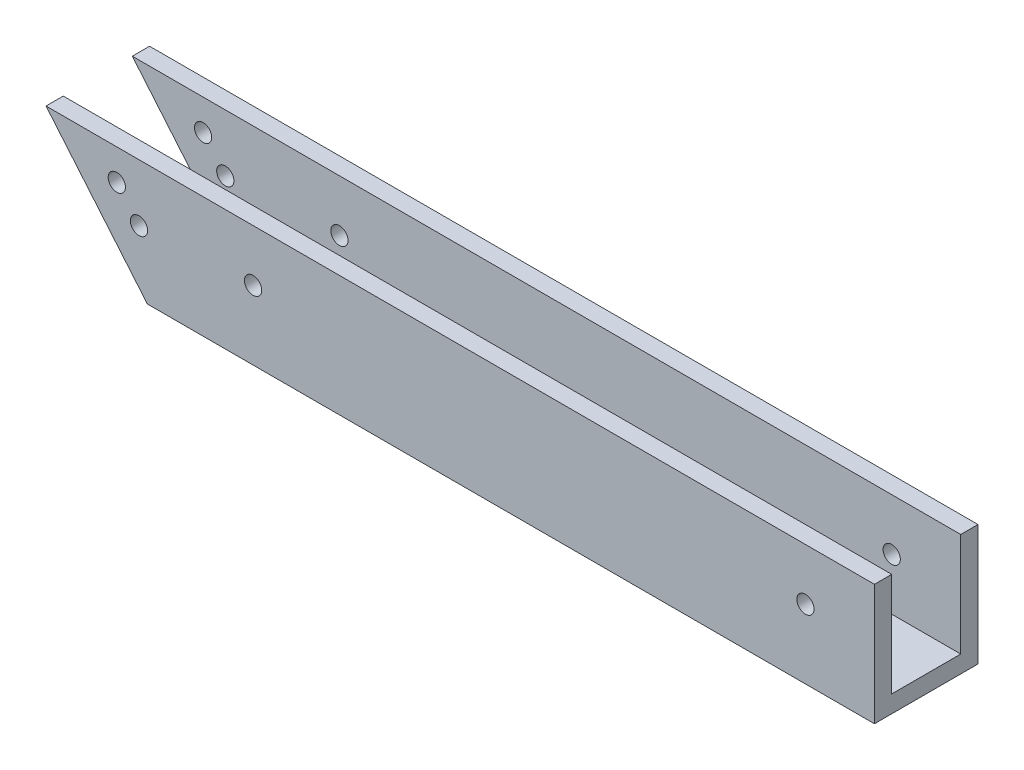
ISO-10303-21;
HEADER;
FILE_DESCRIPTION(('STEP AP214'),'2;1');
FILE_NAME('part.step','',(''),(''),'','','');
FILE_SCHEMA(('AUTOMOTIVE_DESIGN { 1 0 10303 214 1 1 1 1 }'));
ENDSEC;
DATA;
#1=APPLICATION_CONTEXT('core data for automotive mechanical design processes');
#2=APPLICATION_PROTOCOL_DEFINITION('international standard','automotive_design',2000,#1);
#3=PRODUCT_CONTEXT('',#1,'mechanical');
#4=PRODUCT('Part','Part','',(#3));
#5=PRODUCT_RELATED_PRODUCT_CATEGORY('part','',(#4));
#6=PRODUCT_DEFINITION_FORMATION('','',#4);
#7=PRODUCT_DEFINITION_CONTEXT('part definition',#1,'design');
#8=PRODUCT_DEFINITION('design','',#6,#7);
#9=PRODUCT_DEFINITION_SHAPE('','',#8);
#10=(LENGTH_UNIT() NAMED_UNIT(*) SI_UNIT(.MILLI.,.METRE.));
#11=(NAMED_UNIT(*) PLANE_ANGLE_UNIT() SI_UNIT($,.RADIAN.));
#12=(NAMED_UNIT(*) SI_UNIT($,.STERADIAN.) SOLID_ANGLE_UNIT());
#13=UNCERTAINTY_MEASURE_WITH_UNIT(LENGTH_MEASURE(1.E-05),#10,'distance_accuracy_value','');
#14=(GEOMETRIC_REPRESENTATION_CONTEXT(3) GLOBAL_UNCERTAINTY_ASSIGNED_CONTEXT((#13)) GLOBAL_UNIT_ASSIGNED_CONTEXT((#10,
#11,#12)) REPRESENTATION_CONTEXT('',''));
#15=CARTESIAN_POINT('',(0.,0.,0.));
#16=DIRECTION('',(0.,0.,1.));
#17=DIRECTION('',(1.,0.,0.));
#18=AXIS2_PLACEMENT_3D('',#15,#16,#17);
#19=CARTESIAN_POINT('',(0.,44.45,0.));
#20=DIRECTION('',(0.,-1.,0.));
#21=DIRECTION('',(0.,0.,-1.));
#22=AXIS2_PLACEMENT_3D('',#19,#20,#21);
#23=PLANE('',#22);
#24=DIRECTION('',(0.,0.,1.));
#25=VECTOR('',#24,1.);
#26=CARTESIAN_POINT('',(-152.4,44.45,19.05));
#27=LINE('',#26,#25);
#28=CARTESIAN_POINT('',(-152.4,44.45,-19.05));
#29=VERTEX_POINT('',#28);
#30=CARTESIAN_POINT('',(-152.4,44.45,-12.7));
#31=VERTEX_POINT('',#30);
#32=EDGE_CURVE('E129',#29,#31,#27,.T.);
#33=ORIENTED_EDGE('',*,*,#32,.T.);
#34=DIRECTION('',(-1.,0.,0.));
#35=VECTOR('',#34,1.);
#36=CARTESIAN_POINT('',(152.4,44.45,-12.7));
#37=LINE('',#36,#35);
#38=CARTESIAN_POINT('',(152.4,44.45,-12.7));
#39=VERTEX_POINT('',#38);
#40=EDGE_CURVE('E161',#39,#31,#37,.T.);
#41=ORIENTED_EDGE('',*,*,#40,.F.);
#42=DIRECTION('',(0.,0.,-1.));
#43=VECTOR('',#42,1.);
#44=CARTESIAN_POINT('',(152.4,44.45,19.05));
#45=LINE('',#44,#43);
#46=CARTESIAN_POINT('',(152.4,44.45,-19.05));
#47=VERTEX_POINT('',#46);
#48=EDGE_CURVE('E89',#39,#47,#45,.T.);
#49=ORIENTED_EDGE('',*,*,#48,.T.);
#50=DIRECTION('',(-1.,0.,0.));
#51=VECTOR('',#50,1.);
#52=CARTESIAN_POINT('',(-152.4,44.45,-19.05));
#53=LINE('',#52,#51);
#54=EDGE_CURVE('E117',#47,#29,#53,.T.);
#55=ORIENTED_EDGE('',*,*,#54,.T.);
#56=EDGE_LOOP('',(#33,#41,#49,#55));
#57=FACE_BOUND('',#56,.T.);
#58=ADVANCED_FACE('F41',(#57),#23,.F.);
#59=CARTESIAN_POINT('',(152.4,44.45,19.05));
#60=DIRECTION('',(-1.,0.,0.));
#61=DIRECTION('',(0.,0.,1.));
#62=AXIS2_PLACEMENT_3D('',#59,#60,#61);
#63=PLANE('',#62);
#64=ORIENTED_EDGE('',*,*,#48,.F.);
#65=DIRECTION('',(0.,1.,0.));
#66=VECTOR('',#65,1.);
#67=CARTESIAN_POINT('',(152.4,6.34999999999999,-12.7));
#68=LINE('',#67,#66);
#69=CARTESIAN_POINT('',(152.4,6.34999999999999,-12.7));
#70=VERTEX_POINT('',#69);
#71=EDGE_CURVE('E103',#70,#39,#68,.T.);
#72=ORIENTED_EDGE('',*,*,#71,.F.);
#73=DIRECTION('',(0.,0.,-1.));
#74=VECTOR('',#73,1.);
#75=CARTESIAN_POINT('',(152.4,6.34999999999999,12.7));
#76=LINE('',#75,#74);
#77=CARTESIAN_POINT('',(152.4,6.34999999999999,12.7));
#78=VERTEX_POINT('',#77);
#79=EDGE_CURVE('E160',#78,#70,#76,.T.);
#80=ORIENTED_EDGE('',*,*,#79,.F.);
#81=DIRECTION('',(0.,1.,0.));
#82=VECTOR('',#81,1.);
#83=CARTESIAN_POINT('',(152.4,6.34999999999999,12.7));
#84=LINE('',#83,#82);
#85=CARTESIAN_POINT('',(152.4,44.45,12.7));
#86=VERTEX_POINT('',#85);
#87=EDGE_CURVE('E107',#78,#86,#84,.T.);
#88=ORIENTED_EDGE('',*,*,#87,.T.);
#89=CARTESIAN_POINT('',(152.4,44.45,19.05));
#90=VERTEX_POINT('',#89);
#91=EDGE_CURVE('E98',#90,#86,#45,.T.);
#92=ORIENTED_EDGE('',*,*,#91,.F.);
#93=DIRECTION('',(0.,-1.,0.));
#94=VECTOR('',#93,1.);
#95=CARTESIAN_POINT('',(152.4,44.45,19.05));
#96=LINE('',#95,#94);
#97=CARTESIAN_POINT('',(152.4,0.,19.05));
#98=VERTEX_POINT('',#97);
#99=EDGE_CURVE('E81',#90,#98,#96,.T.);
#100=ORIENTED_EDGE('',*,*,#99,.T.);
#101=DIRECTION('',(0.,0.,-1.));
#102=VECTOR('',#101,1.);
#103=CARTESIAN_POINT('',(152.4,0.,19.05));
#104=LINE('',#103,#102);
#105=CARTESIAN_POINT('',(152.4,0.,-19.05));
#106=VERTEX_POINT('',#105);
#107=EDGE_CURVE('E96',#98,#106,#104,.T.);
#108=ORIENTED_EDGE('',*,*,#107,.T.);
#109=DIRECTION('',(0.,-1.,0.));
#110=VECTOR('',#109,1.);
#111=CARTESIAN_POINT('',(152.4,44.45,-19.05));
#112=LINE('',#111,#110);
#113=EDGE_CURVE('E49',#47,#106,#112,.T.);
#114=ORIENTED_EDGE('',*,*,#113,.F.);
#115=EDGE_LOOP('',(#64,#72,#80,#88,#92,#100,#108,#114));
#116=FACE_BOUND('',#115,.T.);
#117=ADVANCED_FACE('F43',(#116),#63,.F.);
#118=CARTESIAN_POINT('',(-152.4,44.45,-19.05));
#119=DIRECTION('',(0.,0.,1.));
#120=DIRECTION('',(1.,0.,0.));
#121=AXIS2_PLACEMENT_3D('',#118,#119,#120);
#122=PLANE('',#121);
#123=CARTESIAN_POINT('',(127.,25.4,-19.05));
#124=DIRECTION('',(0.,0.,1.));
#125=DIRECTION('',(1.,0.,0.));
#126=AXIS2_PLACEMENT_3D('',#123,#124,#125);
#127=CIRCLE('',#126,3.175);
#128=CARTESIAN_POINT('',(130.175,25.4,-19.05));
#129=VERTEX_POINT('',#128);
#130=EDGE_CURVE('E314',#129,#129,#127,.T.);
#131=ORIENTED_EDGE('',*,*,#130,.T.);
#132=EDGE_LOOP('',(#131));
#133=FACE_BOUND('',#132,.T.);
#134=CARTESIAN_POINT('',(-76.2,25.4,-19.05));
#135=DIRECTION('',(0.,0.,1.));
#136=DIRECTION('',(1.,0.,0.));
#137=AXIS2_PLACEMENT_3D('',#134,#135,#136);
#138=CIRCLE('',#137,3.175);
#139=CARTESIAN_POINT('',(-73.025,25.4,-19.05));
#140=VERTEX_POINT('',#139);
#141=EDGE_CURVE('E310',#140,#140,#138,.T.);
#142=ORIENTED_EDGE('',*,*,#141,.T.);
#143=EDGE_LOOP('',(#142));
#144=FACE_BOUND('',#143,.T.);
#145=CARTESIAN_POINT('',(-118.181027643332,23.4271093601861,-19.05));
#146=DIRECTION('',(0.,0.,1.));
#147=DIRECTION('',(1.,0.,0.));
#148=AXIS2_PLACEMENT_3D('',#145,#146,#147);
#149=CIRCLE('',#148,3.175);
#150=CARTESIAN_POINT('',(-115.006027643332,23.4271093601861,-19.05));
#151=VERTEX_POINT('',#150);
#152=EDGE_CURVE('E271',#151,#151,#149,.T.);
#153=ORIENTED_EDGE('',*,*,#152,.T.);
#154=EDGE_LOOP('',(#153));
#155=FACE_BOUND('',#154,.T.);
#156=CARTESIAN_POINT('',(-126.344430286351,33.1558737877971,-19.05));
#157=DIRECTION('',(0.,0.,1.));
#158=DIRECTION('',(1.,0.,0.));
#159=AXIS2_PLACEMENT_3D('',#156,#157,#158);
#160=CIRCLE('',#159,3.175);
#161=CARTESIAN_POINT('',(-123.169430286351,33.1558737877971,-19.05));
#162=VERTEX_POINT('',#161);
#163=EDGE_CURVE('E266',#162,#162,#160,.T.);
#164=ORIENTED_EDGE('',*,*,#163,.T.);
#165=EDGE_LOOP('',(#164));
#166=FACE_BOUND('',#165,.T.);
#167=DIRECTION('',(-1.,0.,0.));
#168=VECTOR('',#167,1.);
#169=CARTESIAN_POINT('',(-152.4,0.,-19.05));
#170=LINE('',#169,#168);
#171=CARTESIAN_POINT('',(-115.10202139417,0.,-19.05));
#172=VERTEX_POINT('',#171);
#173=EDGE_CURVE('E90',#106,#172,#170,.T.);
#174=ORIENTED_EDGE('',*,*,#173,.T.);
#175=DIRECTION('',(-0.642787609686541,0.766044443118977,0.));
#176=VECTOR('',#175,1.);
#177=CARTESIAN_POINT('',(-152.4,44.45,-19.05));
#178=LINE('',#177,#176);
#179=EDGE_CURVE('E155',#172,#29,#178,.T.);
#180=ORIENTED_EDGE('',*,*,#179,.T.);
#181=ORIENTED_EDGE('',*,*,#54,.F.);
#182=ORIENTED_EDGE('',*,*,#113,.T.);
#183=EDGE_LOOP('',(#174,#180,#181,#182));
#184=FACE_BOUND('',#183,.T.);
#185=ADVANCED_FACE('F113',(#133,#144,#155,#166,#184),#122,.F.);
#186=CARTESIAN_POINT('',(-152.4,44.45,19.05));
#187=DIRECTION('',(0.,0.,-1.));
#188=DIRECTION('',(-1.,0.,0.));
#189=AXIS2_PLACEMENT_3D('',#186,#187,#188);
#190=PLANE('',#189);
#191=CARTESIAN_POINT('',(127.,25.4,19.05));
#192=DIRECTION('',(0.,0.,1.));
#193=DIRECTION('',(1.,0.,0.));
#194=AXIS2_PLACEMENT_3D('',#191,#192,#193);
#195=CIRCLE('',#194,3.175);
#196=CARTESIAN_POINT('',(130.175,25.4,19.05));
#197=VERTEX_POINT('',#196);
#198=EDGE_CURVE('E200',#197,#197,#195,.T.);
#199=ORIENTED_EDGE('',*,*,#198,.F.);
#200=EDGE_LOOP('',(#199));
#201=FACE_BOUND('',#200,.T.);
#202=CARTESIAN_POINT('',(-76.2,25.4,19.05));
#203=DIRECTION('',(0.,0.,1.));
#204=DIRECTION('',(1.,0.,0.));
#205=AXIS2_PLACEMENT_3D('',#202,#203,#204);
#206=CIRCLE('',#205,3.175);
#207=CARTESIAN_POINT('',(-73.025,25.4,19.05));
#208=VERTEX_POINT('',#207);
#209=EDGE_CURVE('E204',#208,#208,#206,.T.);
#210=ORIENTED_EDGE('',*,*,#209,.F.);
#211=EDGE_LOOP('',(#210));
#212=FACE_BOUND('',#211,.T.);
#213=CARTESIAN_POINT('',(-118.181027643332,23.4271093601861,19.05));
#214=DIRECTION('',(0.,0.,1.));
#215=DIRECTION('',(1.,0.,0.));
#216=AXIS2_PLACEMENT_3D('',#213,#214,#215);
#217=CIRCLE('',#216,3.175);
#218=CARTESIAN_POINT('',(-115.006027643332,23.4271093601861,19.05));
#219=VERTEX_POINT('',#218);
#220=EDGE_CURVE('E208',#219,#219,#217,.T.);
#221=ORIENTED_EDGE('',*,*,#220,.F.);
#222=EDGE_LOOP('',(#221));
#223=FACE_BOUND('',#222,.T.);
#224=CARTESIAN_POINT('',(-126.344430286351,33.1558737877971,19.05));
#225=DIRECTION('',(0.,0.,1.));
#226=DIRECTION('',(1.,0.,0.));
#227=AXIS2_PLACEMENT_3D('',#224,#225,#226);
#228=CIRCLE('',#227,3.175);
#229=CARTESIAN_POINT('',(-123.169430286351,33.1558737877971,19.05));
#230=VERTEX_POINT('',#229);
#231=EDGE_CURVE('E211',#230,#230,#228,.T.);
#232=ORIENTED_EDGE('',*,*,#231,.F.);
#233=EDGE_LOOP('',(#232));
#234=FACE_BOUND('',#233,.T.);
#235=DIRECTION('',(1.,0.,0.));
#236=VECTOR('',#235,1.);
#237=CARTESIAN_POINT('',(-152.4,44.45,19.05));
#238=LINE('',#237,#236);
#239=CARTESIAN_POINT('',(-152.4,44.45,19.05));
#240=VERTEX_POINT('',#239);
#241=EDGE_CURVE('E64',#240,#90,#238,.T.);
#242=ORIENTED_EDGE('',*,*,#241,.F.);
#243=DIRECTION('',(-0.642787609686541,0.766044443118977,0.));
#244=VECTOR('',#243,1.);
#245=CARTESIAN_POINT('',(-152.4,44.45,19.05));
#246=LINE('',#245,#244);
#247=CARTESIAN_POINT('',(-115.10202139417,0.,19.05));
#248=VERTEX_POINT('',#247);
#249=EDGE_CURVE('E85',#248,#240,#246,.T.);
#250=ORIENTED_EDGE('',*,*,#249,.F.);
#251=DIRECTION('',(1.,0.,0.));
#252=VECTOR('',#251,1.);
#253=CARTESIAN_POINT('',(-152.4,0.,19.05));
#254=LINE('',#253,#252);
#255=EDGE_CURVE('E78',#248,#98,#254,.T.);
#256=ORIENTED_EDGE('',*,*,#255,.T.);
#257=ORIENTED_EDGE('',*,*,#99,.F.);
#258=EDGE_LOOP('',(#242,#250,#256,#257));
#259=FACE_BOUND('',#258,.T.);
#260=ADVANCED_FACE('F80',(#201,#212,#223,#234,#259),#190,.F.);
#261=ORIENTED_EDGE('',*,*,#91,.T.);
#262=DIRECTION('',(1.,0.,0.));
#263=VECTOR('',#262,1.);
#264=CARTESIAN_POINT('',(152.4,44.45,12.7));
#265=LINE('',#264,#263);
#266=CARTESIAN_POINT('',(-152.4,44.45,12.7));
#267=VERTEX_POINT('',#266);
#268=EDGE_CURVE('E138',#267,#86,#265,.T.);
#269=ORIENTED_EDGE('',*,*,#268,.F.);
#270=EDGE_CURVE('E128',#267,#240,#27,.T.);
#271=ORIENTED_EDGE('',*,*,#270,.T.);
#272=ORIENTED_EDGE('',*,*,#241,.T.);
#273=EDGE_LOOP('',(#261,#269,#271,#272));
#274=FACE_BOUND('',#273,.T.);
#275=ADVANCED_FACE('F135',(#274),#23,.F.);
#276=CARTESIAN_POINT('',(0.,0.,0.));
#277=DIRECTION('',(0.,-1.,0.));
#278=DIRECTION('',(0.,0.,-1.));
#279=AXIS2_PLACEMENT_3D('',#276,#277,#278);
#280=PLANE('',#279);
#281=CARTESIAN_POINT('',(-12.7,0.,0.));
#282=DIRECTION('',(0.,1.,0.));
#283=DIRECTION('',(0.,0.,1.));
#284=AXIS2_PLACEMENT_3D('',#281,#282,#283);
#285=CIRCLE('',#284,3.3782);
#286=CARTESIAN_POINT('',(-12.7,0.,3.3782));
#287=VERTEX_POINT('',#286);
#288=EDGE_CURVE('E293',#287,#287,#285,.T.);
#289=ORIENTED_EDGE('',*,*,#288,.T.);
#290=EDGE_LOOP('',(#289));
#291=FACE_BOUND('',#290,.T.);
#292=CARTESIAN_POINT('',(12.7,0.,0.));
#293=DIRECTION('',(0.,1.,0.));
#294=DIRECTION('',(0.,0.,1.));
#295=AXIS2_PLACEMENT_3D('',#292,#293,#294);
#296=CIRCLE('',#295,3.3782);
#297=CARTESIAN_POINT('',(12.7,0.,3.3782));
#298=VERTEX_POINT('',#297);
#299=EDGE_CURVE('E284',#298,#298,#296,.T.);
#300=ORIENTED_EDGE('',*,*,#299,.T.);
#301=EDGE_LOOP('',(#300));
#302=FACE_BOUND('',#301,.T.);
#303=CARTESIAN_POINT('',(38.1,0.,0.));
#304=DIRECTION('',(0.,1.,0.));
#305=DIRECTION('',(0.,0.,1.));
#306=AXIS2_PLACEMENT_3D('',#303,#304,#305);
#307=CIRCLE('',#306,3.3782);
#308=CARTESIAN_POINT('',(38.1,0.,3.3782));
#309=VERTEX_POINT('',#308);
#310=EDGE_CURVE('E274',#309,#309,#307,.T.);
#311=ORIENTED_EDGE('',*,*,#310,.T.);
#312=EDGE_LOOP('',(#311));
#313=FACE_BOUND('',#312,.T.);
#314=DIRECTION('',(0.,0.,1.));
#315=VECTOR('',#314,1.);
#316=CARTESIAN_POINT('',(-115.10202139417,0.,-19.05));
#317=LINE('',#316,#315);
#318=EDGE_CURVE('E151',#172,#248,#317,.T.);
#319=ORIENTED_EDGE('',*,*,#318,.F.);
#320=ORIENTED_EDGE('',*,*,#173,.F.);
#321=ORIENTED_EDGE('',*,*,#107,.F.);
#322=ORIENTED_EDGE('',*,*,#255,.F.);
#323=EDGE_LOOP('',(#319,#320,#321,#322));
#324=FACE_BOUND('',#323,.T.);
#325=ADVANCED_FACE('F100',(#291,#302,#313,#324),#280,.T.);
#326=CARTESIAN_POINT('',(152.4,6.34999999999999,-12.7));
#327=DIRECTION('',(0.,0.,-1.));
#328=DIRECTION('',(-1.,0.,0.));
#329=AXIS2_PLACEMENT_3D('',#326,#327,#328);
#330=PLANE('',#329);
#331=CARTESIAN_POINT('',(127.,25.4,-12.7));
#332=DIRECTION('',(0.,0.,1.));
#333=DIRECTION('',(1.,0.,0.));
#334=AXIS2_PLACEMENT_3D('',#331,#332,#333);
#335=CIRCLE('',#334,3.175);
#336=CARTESIAN_POINT('',(130.175,25.4,-12.7));
#337=VERTEX_POINT('',#336);
#338=EDGE_CURVE('E253',#337,#337,#335,.T.);
#339=ORIENTED_EDGE('',*,*,#338,.F.);
#340=EDGE_LOOP('',(#339));
#341=FACE_BOUND('',#340,.T.);
#342=CARTESIAN_POINT('',(-76.2,25.4,-12.7));
#343=DIRECTION('',(0.,0.,1.));
#344=DIRECTION('',(1.,0.,0.));
#345=AXIS2_PLACEMENT_3D('',#342,#343,#344);
#346=CIRCLE('',#345,3.175);
#347=CARTESIAN_POINT('',(-73.025,25.4,-12.7));
#348=VERTEX_POINT('',#347);
#349=EDGE_CURVE('E257',#348,#348,#346,.T.);
#350=ORIENTED_EDGE('',*,*,#349,.F.);
#351=EDGE_LOOP('',(#350));
#352=FACE_BOUND('',#351,.T.);
#353=CARTESIAN_POINT('',(-118.181027643332,23.4271093601861,-12.7));
#354=DIRECTION('',(0.,0.,1.));
#355=DIRECTION('',(1.,0.,0.));
#356=AXIS2_PLACEMENT_3D('',#353,#354,#355);
#357=CIRCLE('',#356,3.175);
#358=CARTESIAN_POINT('',(-115.006027643332,23.4271093601861,-12.7));
#359=VERTEX_POINT('',#358);
#360=EDGE_CURVE('E261',#359,#359,#357,.T.);
#361=ORIENTED_EDGE('',*,*,#360,.F.);
#362=EDGE_LOOP('',(#361));
#363=FACE_BOUND('',#362,.T.);
#364=CARTESIAN_POINT('',(-126.344430286351,33.1558737877971,-12.7));
#365=DIRECTION('',(0.,0.,1.));
#366=DIRECTION('',(1.,0.,0.));
#367=AXIS2_PLACEMENT_3D('',#364,#365,#366);
#368=CIRCLE('',#367,3.175);
#369=CARTESIAN_POINT('',(-123.169430286351,33.1558737877971,-12.7));
#370=VERTEX_POINT('',#369);
#371=EDGE_CURVE('E264',#370,#370,#368,.T.);
#372=ORIENTED_EDGE('',*,*,#371,.F.);
#373=EDGE_LOOP('',(#372));
#374=FACE_BOUND('',#373,.T.);
#375=ORIENTED_EDGE('',*,*,#40,.T.);
#376=DIRECTION('',(0.642787609686541,-0.766044443118977,0.));
#377=VECTOR('',#376,1.);
#378=CARTESIAN_POINT('',(-7.70339458155694,-127.992699343616,-12.7));
#379=LINE('',#378,#377);
#380=CARTESIAN_POINT('',(-120.430304052145,6.34999999999999,-12.7));
#381=VERTEX_POINT('',#380);
#382=EDGE_CURVE('E150',#31,#381,#379,.T.);
#383=ORIENTED_EDGE('',*,*,#382,.T.);
#384=DIRECTION('',(-1.,0.,0.));
#385=VECTOR('',#384,1.);
#386=CARTESIAN_POINT('',(152.4,6.34999999999999,-12.7));
#387=LINE('',#386,#385);
#388=EDGE_CURVE('E164',#70,#381,#387,.T.);
#389=ORIENTED_EDGE('',*,*,#388,.F.);
#390=ORIENTED_EDGE('',*,*,#71,.T.);
#391=EDGE_LOOP('',(#375,#383,#389,#390));
#392=FACE_BOUND('',#391,.T.);
#393=ADVANCED_FACE('F170',(#341,#352,#363,#374,#392),#330,.F.);
#394=CARTESIAN_POINT('',(152.4,6.34999999999999,12.7));
#395=DIRECTION('',(0.,0.,1.));
#396=DIRECTION('',(1.,0.,0.));
#397=AXIS2_PLACEMENT_3D('',#394,#395,#396);
#398=PLANE('',#397);
#399=CARTESIAN_POINT('',(127.,25.4,12.7));
#400=DIRECTION('',(0.,0.,1.));
#401=DIRECTION('',(1.,0.,0.));
#402=AXIS2_PLACEMENT_3D('',#399,#400,#401);
#403=CIRCLE('',#402,3.175);
#404=CARTESIAN_POINT('',(130.175,25.4,12.7));
#405=VERTEX_POINT('',#404);
#406=EDGE_CURVE('E304',#405,#405,#403,.T.);
#407=ORIENTED_EDGE('',*,*,#406,.T.);
#408=EDGE_LOOP('',(#407));
#409=FACE_BOUND('',#408,.T.);
#410=CARTESIAN_POINT('',(-76.2,25.4,12.7));
#411=DIRECTION('',(0.,0.,1.));
#412=DIRECTION('',(1.,0.,0.));
#413=AXIS2_PLACEMENT_3D('',#410,#411,#412);
#414=CIRCLE('',#413,3.175);
#415=CARTESIAN_POINT('',(-73.025,25.4,12.7));
#416=VERTEX_POINT('',#415);
#417=EDGE_CURVE('E302',#416,#416,#414,.T.);
#418=ORIENTED_EDGE('',*,*,#417,.T.);
#419=EDGE_LOOP('',(#418));
#420=FACE_BOUND('',#419,.T.);
#421=CARTESIAN_POINT('',(-118.181027643332,23.4271093601861,12.7));
#422=DIRECTION('',(0.,0.,1.));
#423=DIRECTION('',(1.,0.,0.));
#424=AXIS2_PLACEMENT_3D('',#421,#422,#423);
#425=CIRCLE('',#424,3.175);
#426=CARTESIAN_POINT('',(-115.006027643332,23.4271093601861,12.7));
#427=VERTEX_POINT('',#426);
#428=EDGE_CURVE('E214',#427,#427,#425,.T.);
#429=ORIENTED_EDGE('',*,*,#428,.T.);
#430=EDGE_LOOP('',(#429));
#431=FACE_BOUND('',#430,.T.);
#432=CARTESIAN_POINT('',(-126.344430286351,33.1558737877971,12.7));
#433=DIRECTION('',(0.,0.,1.));
#434=DIRECTION('',(1.,0.,0.));
#435=AXIS2_PLACEMENT_3D('',#432,#433,#434);
#436=CIRCLE('',#435,3.175);
#437=CARTESIAN_POINT('',(-123.169430286351,33.1558737877971,12.7));
#438=VERTEX_POINT('',#437);
#439=EDGE_CURVE('E213',#438,#438,#436,.T.);
#440=ORIENTED_EDGE('',*,*,#439,.T.);
#441=EDGE_LOOP('',(#440));
#442=FACE_BOUND('',#441,.T.);
#443=DIRECTION('',(1.,0.,0.));
#444=VECTOR('',#443,1.);
#445=CARTESIAN_POINT('',(152.4,6.34999999999999,12.7));
#446=LINE('',#445,#444);
#447=CARTESIAN_POINT('',(-120.430304052145,6.34999999999999,12.7));
#448=VERTEX_POINT('',#447);
#449=EDGE_CURVE('E149',#448,#78,#446,.T.);
#450=ORIENTED_EDGE('',*,*,#449,.F.);
#451=DIRECTION('',(-0.642787609686541,0.766044443118977,0.));
#452=VECTOR('',#451,1.);
#453=CARTESIAN_POINT('',(-7.70339458155694,-127.992699343616,12.7));
#454=LINE('',#453,#452);
#455=EDGE_CURVE('E55',#448,#267,#454,.T.);
#456=ORIENTED_EDGE('',*,*,#455,.T.);
#457=ORIENTED_EDGE('',*,*,#268,.T.);
#458=ORIENTED_EDGE('',*,*,#87,.F.);
#459=EDGE_LOOP('',(#450,#456,#457,#458));
#460=FACE_BOUND('',#459,.T.);
#461=ADVANCED_FACE('F146',(#409,#420,#431,#442,#460),#398,.F.);
#462=CARTESIAN_POINT('',(0.,6.34999999999999,0.));
#463=DIRECTION('',(0.,1.,0.));
#464=DIRECTION('',(0.,0.,1.));
#465=AXIS2_PLACEMENT_3D('',#462,#463,#464);
#466=PLANE('',#465);
#467=CARTESIAN_POINT('',(-12.7,6.35,0.));
#468=DIRECTION('',(0.,1.,0.));
#469=DIRECTION('',(0.,0.,1.));
#470=AXIS2_PLACEMENT_3D('',#467,#468,#469);
#471=CIRCLE('',#470,6.4389);
#472=CARTESIAN_POINT('',(-12.7,6.35,6.4389));
#473=VERTEX_POINT('',#472);
#474=EDGE_CURVE('E299',#473,#473,#471,.T.);
#475=ORIENTED_EDGE('',*,*,#474,.F.);
#476=EDGE_LOOP('',(#475));
#477=FACE_BOUND('',#476,.T.);
#478=CARTESIAN_POINT('',(12.7,6.35,0.));
#479=DIRECTION('',(0.,1.,0.));
#480=DIRECTION('',(0.,0.,1.));
#481=AXIS2_PLACEMENT_3D('',#478,#479,#480);
#482=CIRCLE('',#481,6.4389);
#483=CARTESIAN_POINT('',(12.7,6.35,6.4389));
#484=VERTEX_POINT('',#483);
#485=EDGE_CURVE('E290',#484,#484,#482,.T.);
#486=ORIENTED_EDGE('',*,*,#485,.F.);
#487=EDGE_LOOP('',(#486));
#488=FACE_BOUND('',#487,.T.);
#489=CARTESIAN_POINT('',(38.1,6.35,0.));
#490=DIRECTION('',(0.,1.,0.));
#491=DIRECTION('',(0.,0.,1.));
#492=AXIS2_PLACEMENT_3D('',#489,#490,#491);
#493=CIRCLE('',#492,6.4389);
#494=CARTESIAN_POINT('',(38.1,6.35,6.4389));
#495=VERTEX_POINT('',#494);
#496=EDGE_CURVE('E281',#495,#495,#493,.T.);
#497=ORIENTED_EDGE('',*,*,#496,.F.);
#498=EDGE_LOOP('',(#497));
#499=FACE_BOUND('',#498,.T.);
#500=DIRECTION('',(0.,0.,-1.));
#501=VECTOR('',#500,1.);
#502=CARTESIAN_POINT('',(-120.430304052145,6.34999999999999,0.));
#503=LINE('',#502,#501);
#504=EDGE_CURVE('E11',#448,#381,#503,.T.);
#505=ORIENTED_EDGE('',*,*,#504,.F.);
#506=ORIENTED_EDGE('',*,*,#449,.T.);
#507=ORIENTED_EDGE('',*,*,#79,.T.);
#508=ORIENTED_EDGE('',*,*,#388,.T.);
#509=EDGE_LOOP('',(#505,#506,#507,#508));
#510=FACE_BOUND('',#509,.T.);
#511=ADVANCED_FACE('F231',(#477,#488,#499,#510),#466,.T.);
#512=CARTESIAN_POINT('',(-152.4,44.45,-19.05));
#513=DIRECTION('',(0.766044443118977,0.642787609686541,0.));
#514=DIRECTION('',(-0.642787609686541,0.766044443118977,0.));
#515=AXIS2_PLACEMENT_3D('',#512,#513,#514);
#516=PLANE('',#515);
#517=ORIENTED_EDGE('',*,*,#32,.F.);
#518=ORIENTED_EDGE('',*,*,#179,.F.);
#519=ORIENTED_EDGE('',*,*,#318,.T.);
#520=ORIENTED_EDGE('',*,*,#249,.T.);
#521=ORIENTED_EDGE('',*,*,#270,.F.);
#522=ORIENTED_EDGE('',*,*,#455,.F.);
#523=ORIENTED_EDGE('',*,*,#504,.T.);
#524=ORIENTED_EDGE('',*,*,#382,.F.);
#525=EDGE_LOOP('',(#517,#518,#519,#520,#521,#522,#523,#524));
#526=FACE_BOUND('',#525,.T.);
#527=ADVANCED_FACE('F140',(#526),#516,.F.);
#528=CARTESIAN_POINT('',(-126.344430286351,33.1558737877971,12.7));
#529=DIRECTION('',(0.,0.,1.));
#530=DIRECTION('',(1.,0.,0.));
#531=AXIS2_PLACEMENT_3D('',#528,#529,#530);
#532=CYLINDRICAL_SURFACE('',#531,3.175);
#533=ORIENTED_EDGE('',*,*,#439,.F.);
#534=EDGE_LOOP('',(#533));
#535=FACE_BOUND('',#534,.T.);
#536=ORIENTED_EDGE('',*,*,#231,.T.);
#537=EDGE_LOOP('',(#536));
#538=FACE_BOUND('',#537,.T.);
#539=ADVANCED_FACE('F238',(#535,#538),#532,.F.);
#540=CARTESIAN_POINT('',(-118.181027643332,23.4271093601861,12.7));
#541=DIRECTION('',(0.,0.,1.));
#542=DIRECTION('',(1.,0.,0.));
#543=AXIS2_PLACEMENT_3D('',#540,#541,#542);
#544=CYLINDRICAL_SURFACE('',#543,3.175);
#545=ORIENTED_EDGE('',*,*,#428,.F.);
#546=EDGE_LOOP('',(#545));
#547=FACE_BOUND('',#546,.T.);
#548=ORIENTED_EDGE('',*,*,#220,.T.);
#549=EDGE_LOOP('',(#548));
#550=FACE_BOUND('',#549,.T.);
#551=ADVANCED_FACE('F334',(#547,#550),#544,.F.);
#552=CARTESIAN_POINT('',(-126.344430286351,33.1558737877971,-12.7));
#553=DIRECTION('',(0.,0.,-1.));
#554=DIRECTION('',(-1.,0.,0.));
#555=AXIS2_PLACEMENT_3D('',#552,#553,#554);
#556=CYLINDRICAL_SURFACE('',#555,3.175);
#557=ORIENTED_EDGE('',*,*,#371,.T.);
#558=EDGE_LOOP('',(#557));
#559=FACE_BOUND('',#558,.T.);
#560=ORIENTED_EDGE('',*,*,#163,.F.);
#561=EDGE_LOOP('',(#560));
#562=FACE_BOUND('',#561,.T.);
#563=ADVANCED_FACE('F331',(#559,#562),#556,.F.);
#564=CARTESIAN_POINT('',(-118.181027643332,23.4271093601861,-12.7));
#565=DIRECTION('',(0.,0.,-1.));
#566=DIRECTION('',(-1.,0.,0.));
#567=AXIS2_PLACEMENT_3D('',#564,#565,#566);
#568=CYLINDRICAL_SURFACE('',#567,3.175);
#569=ORIENTED_EDGE('',*,*,#360,.T.);
#570=EDGE_LOOP('',(#569));
#571=FACE_BOUND('',#570,.T.);
#572=ORIENTED_EDGE('',*,*,#152,.F.);
#573=EDGE_LOOP('',(#572));
#574=FACE_BOUND('',#573,.T.);
#575=ADVANCED_FACE('F333',(#571,#574),#568,.F.);
#576=CARTESIAN_POINT('',(38.1,6.34999999999999,0.));
#577=DIRECTION('',(0.,1.,0.));
#578=DIRECTION('',(0.,0.,1.));
#579=AXIS2_PLACEMENT_3D('',#576,#577,#578);
#580=CYLINDRICAL_SURFACE('',#579,3.3782);
#581=ORIENTED_EDGE('',*,*,#310,.F.);
#582=EDGE_LOOP('',(#581));
#583=FACE_BOUND('',#582,.T.);
#584=CARTESIAN_POINT('',(38.1,3.78176775885569,0.));
#585=DIRECTION('',(0.,1.,0.));
#586=DIRECTION('',(0.,0.,1.));
#587=AXIS2_PLACEMENT_3D('',#584,#585,#586);
#588=CIRCLE('',#587,3.3782);
#589=CARTESIAN_POINT('',(38.1,3.78176775885569,3.3782));
#590=VERTEX_POINT('',#589);
#591=EDGE_CURVE('E278',#590,#590,#588,.T.);
#592=ORIENTED_EDGE('',*,*,#591,.T.);
#593=EDGE_LOOP('',(#592));
#594=FACE_BOUND('',#593,.T.);
#595=ADVANCED_FACE('F340',(#583,#594),#580,.F.);
#596=CARTESIAN_POINT('',(38.1,6.35,0.));
#597=DIRECTION('',(0.,1.,0.));
#598=DIRECTION('',(0.,0.,1.));
#599=AXIS2_PLACEMENT_3D('',#596,#597,#598);
#600=CONICAL_SURFACE('',#599,6.4389,0.872664625997165);
#601=ORIENTED_EDGE('',*,*,#591,.F.);
#602=EDGE_LOOP('',(#601));
#603=FACE_BOUND('',#602,.T.);
#604=ORIENTED_EDGE('',*,*,#496,.T.);
#605=EDGE_LOOP('',(#604));
#606=FACE_BOUND('',#605,.T.);
#607=ADVANCED_FACE('F370',(#603,#606),#600,.F.);
#608=CARTESIAN_POINT('',(12.7,6.34999999999999,0.));
#609=DIRECTION('',(0.,1.,0.));
#610=DIRECTION('',(0.,0.,1.));
#611=AXIS2_PLACEMENT_3D('',#608,#609,#610);
#612=CYLINDRICAL_SURFACE('',#611,3.3782);
#613=ORIENTED_EDGE('',*,*,#299,.F.);
#614=EDGE_LOOP('',(#613));
#615=FACE_BOUND('',#614,.T.);
#616=CARTESIAN_POINT('',(12.7,3.78176775885569,0.));
#617=DIRECTION('',(0.,1.,0.));
#618=DIRECTION('',(0.,0.,1.));
#619=AXIS2_PLACEMENT_3D('',#616,#617,#618);
#620=CIRCLE('',#619,3.3782);
#621=CARTESIAN_POINT('',(12.7,3.78176775885569,3.3782));
#622=VERTEX_POINT('',#621);
#623=EDGE_CURVE('E287',#622,#622,#620,.T.);
#624=ORIENTED_EDGE('',*,*,#623,.T.);
#625=EDGE_LOOP('',(#624));
#626=FACE_BOUND('',#625,.T.);
#627=ADVANCED_FACE('F377',(#615,#626),#612,.F.);
#628=CARTESIAN_POINT('',(12.7,6.35,0.));
#629=DIRECTION('',(0.,1.,0.));
#630=DIRECTION('',(0.,0.,1.));
#631=AXIS2_PLACEMENT_3D('',#628,#629,#630);
#632=CONICAL_SURFACE('',#631,6.4389,0.872664625997165);
#633=ORIENTED_EDGE('',*,*,#623,.F.);
#634=EDGE_LOOP('',(#633));
#635=FACE_BOUND('',#634,.T.);
#636=ORIENTED_EDGE('',*,*,#485,.T.);
#637=EDGE_LOOP('',(#636));
#638=FACE_BOUND('',#637,.T.);
#639=ADVANCED_FACE('F385',(#635,#638),#632,.F.);
#640=CARTESIAN_POINT('',(-12.7,6.34999999999999,0.));
#641=DIRECTION('',(0.,1.,0.));
#642=DIRECTION('',(0.,0.,1.));
#643=AXIS2_PLACEMENT_3D('',#640,#641,#642);
#644=CYLINDRICAL_SURFACE('',#643,3.3782);
#645=ORIENTED_EDGE('',*,*,#288,.F.);
#646=EDGE_LOOP('',(#645));
#647=FACE_BOUND('',#646,.T.);
#648=CARTESIAN_POINT('',(-12.7,3.78176775885569,0.));
#649=DIRECTION('',(0.,1.,0.));
#650=DIRECTION('',(0.,0.,1.));
#651=AXIS2_PLACEMENT_3D('',#648,#649,#650);
#652=CIRCLE('',#651,3.3782);
#653=CARTESIAN_POINT('',(-12.7,3.78176775885569,3.3782));
#654=VERTEX_POINT('',#653);
#655=EDGE_CURVE('E296',#654,#654,#652,.T.);
#656=ORIENTED_EDGE('',*,*,#655,.T.);
#657=EDGE_LOOP('',(#656));
#658=FACE_BOUND('',#657,.T.);
#659=ADVANCED_FACE('F393',(#647,#658),#644,.F.);
#660=CARTESIAN_POINT('',(-12.7,6.35,0.));
#661=DIRECTION('',(0.,1.,0.));
#662=DIRECTION('',(0.,0.,1.));
#663=AXIS2_PLACEMENT_3D('',#660,#661,#662);
#664=CONICAL_SURFACE('',#663,6.4389,0.872664625997165);
#665=ORIENTED_EDGE('',*,*,#655,.F.);
#666=EDGE_LOOP('',(#665));
#667=FACE_BOUND('',#666,.T.);
#668=ORIENTED_EDGE('',*,*,#474,.T.);
#669=EDGE_LOOP('',(#668));
#670=FACE_BOUND('',#669,.T.);
#671=ADVANCED_FACE('F401',(#667,#670),#664,.F.);
#672=CARTESIAN_POINT('',(-76.2,25.4,12.7));
#673=DIRECTION('',(0.,0.,1.));
#674=DIRECTION('',(1.,0.,0.));
#675=AXIS2_PLACEMENT_3D('',#672,#673,#674);
#676=CYLINDRICAL_SURFACE('',#675,3.175);
#677=ORIENTED_EDGE('',*,*,#417,.F.);
#678=EDGE_LOOP('',(#677));
#679=FACE_BOUND('',#678,.T.);
#680=ORIENTED_EDGE('',*,*,#209,.T.);
#681=EDGE_LOOP('',(#680));
#682=FACE_BOUND('',#681,.T.);
#683=ADVANCED_FACE('F408',(#679,#682),#676,.F.);
#684=CARTESIAN_POINT('',(127.,25.4,12.7));
#685=DIRECTION('',(0.,0.,1.));
#686=DIRECTION('',(1.,0.,0.));
#687=AXIS2_PLACEMENT_3D('',#684,#685,#686);
#688=CYLINDRICAL_SURFACE('',#687,3.175);
#689=ORIENTED_EDGE('',*,*,#406,.F.);
#690=EDGE_LOOP('',(#689));
#691=FACE_BOUND('',#690,.T.);
#692=ORIENTED_EDGE('',*,*,#198,.T.);
#693=EDGE_LOOP('',(#692));
#694=FACE_BOUND('',#693,.T.);
#695=ADVANCED_FACE('F416',(#691,#694),#688,.F.);
#696=CARTESIAN_POINT('',(-76.2,25.4,-12.7));
#697=DIRECTION('',(0.,0.,-1.));
#698=DIRECTION('',(-1.,0.,0.));
#699=AXIS2_PLACEMENT_3D('',#696,#697,#698);
#700=CYLINDRICAL_SURFACE('',#699,3.175);
#701=ORIENTED_EDGE('',*,*,#349,.T.);
#702=EDGE_LOOP('',(#701));
#703=FACE_BOUND('',#702,.T.);
#704=ORIENTED_EDGE('',*,*,#141,.F.);
#705=EDGE_LOOP('',(#704));
#706=FACE_BOUND('',#705,.T.);
#707=ADVANCED_FACE('F321',(#703,#706),#700,.F.);
#708=CARTESIAN_POINT('',(127.,25.4,-12.7));
#709=DIRECTION('',(0.,0.,-1.));
#710=DIRECTION('',(-1.,0.,0.));
#711=AXIS2_PLACEMENT_3D('',#708,#709,#710);
#712=CYLINDRICAL_SURFACE('',#711,3.175);
#713=ORIENTED_EDGE('',*,*,#338,.T.);
#714=EDGE_LOOP('',(#713));
#715=FACE_BOUND('',#714,.T.);
#716=ORIENTED_EDGE('',*,*,#130,.F.);
#717=EDGE_LOOP('',(#716));
#718=FACE_BOUND('',#717,.T.);
#719=ADVANCED_FACE('F318',(#715,#718),#712,.F.);
#720=CLOSED_SHELL('',(#58,#117,#185,#260,#275,#325,#393,#461,#511,#527,#539,#551,#563,#575,#595,
#607,#627,#639,#659,#671,#683,#695,#707,#719));
#721=MANIFOLD_SOLID_BREP('B2',#720);
#722=ADVANCED_BREP_SHAPE_REPRESENTATION('',(#18,#721),#14);
#723=SHAPE_DEFINITION_REPRESENTATION(#9,#722);
ENDSEC;
END-ISO-10303-21;
